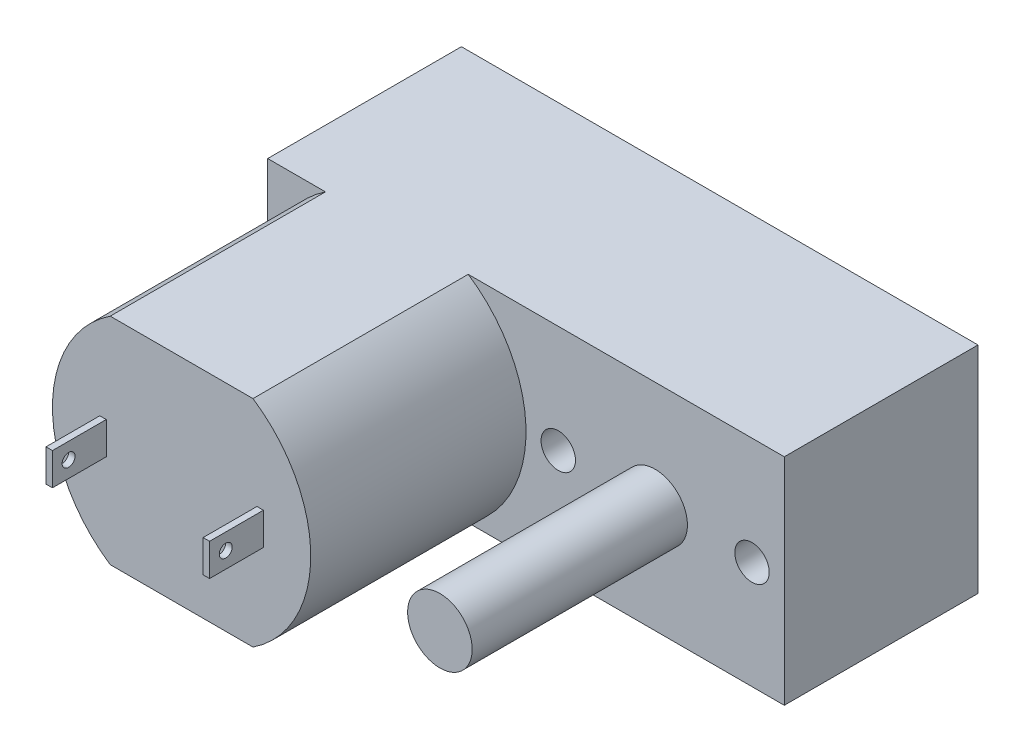
ISO-10303-21;
HEADER;
FILE_DESCRIPTION(('STEP AP214'),'2;1');
FILE_NAME('part.step','',(''),(''),'','','');
FILE_SCHEMA(('AUTOMOTIVE_DESIGN { 1 0 10303 214 1 1 1 1 }'));
ENDSEC;
DATA;
#1=APPLICATION_CONTEXT('core data for automotive mechanical design processes');
#2=APPLICATION_PROTOCOL_DEFINITION('international standard','automotive_design',2000,#1);
#3=PRODUCT_CONTEXT('',#1,'mechanical');
#4=PRODUCT('Part','Part','',(#3));
#5=PRODUCT_RELATED_PRODUCT_CATEGORY('part','',(#4));
#6=PRODUCT_DEFINITION_FORMATION('','',#4);
#7=PRODUCT_DEFINITION_CONTEXT('part definition',#1,'design');
#8=PRODUCT_DEFINITION('design','',#6,#7);
#9=PRODUCT_DEFINITION_SHAPE('','',#8);
#10=(LENGTH_UNIT() NAMED_UNIT(*) SI_UNIT(.MILLI.,.METRE.));
#11=(NAMED_UNIT(*) PLANE_ANGLE_UNIT() SI_UNIT($,.RADIAN.));
#12=(NAMED_UNIT(*) SI_UNIT($,.STERADIAN.) SOLID_ANGLE_UNIT());
#13=UNCERTAINTY_MEASURE_WITH_UNIT(LENGTH_MEASURE(1.E-05),#10,'distance_accuracy_value','');
#14=(GEOMETRIC_REPRESENTATION_CONTEXT(3) GLOBAL_UNCERTAINTY_ASSIGNED_CONTEXT((#13)) GLOBAL_UNIT_ASSIGNED_CONTEXT((#10,
#11,#12)) REPRESENTATION_CONTEXT('',''));
#15=CARTESIAN_POINT('',(0.,0.,0.));
#16=DIRECTION('',(0.,0.,1.));
#17=DIRECTION('',(1.,0.,0.));
#18=AXIS2_PLACEMENT_3D('',#15,#16,#17);
#19=CARTESIAN_POINT('',(0.,0.,19.));
#20=DIRECTION('',(0.,0.,-1.));
#21=DIRECTION('',(-1.,0.,0.));
#22=AXIS2_PLACEMENT_3D('',#19,#20,#21);
#23=PLANE('',#22);
#24=DIRECTION('',(0.,-1.,0.));
#25=VECTOR('',#24,1.);
#26=CARTESIAN_POINT('',(9.5,4.25,19.));
#27=LINE('',#26,#25);
#28=CARTESIAN_POINT('',(9.5,5.75,19.));
#29=VERTEX_POINT('',#28);
#30=CARTESIAN_POINT('',(9.5,4.25,19.));
#31=VERTEX_POINT('',#30);
#32=EDGE_CURVE('E207',#29,#31,#27,.T.);
#33=ORIENTED_EDGE('',*,*,#32,.F.);
#34=DIRECTION('',(-1.,0.,0.));
#35=VECTOR('',#34,1.);
#36=CARTESIAN_POINT('',(9.5,5.75,19.));
#37=LINE('',#36,#35);
#38=CARTESIAN_POINT('',(9.8,5.75,19.));
#39=VERTEX_POINT('',#38);
#40=EDGE_CURVE('E200',#39,#29,#37,.T.);
#41=ORIENTED_EDGE('',*,*,#40,.F.);
#42=DIRECTION('',(0.,1.,0.));
#43=VECTOR('',#42,1.);
#44=CARTESIAN_POINT('',(9.8,4.25,19.));
#45=LINE('',#44,#43);
#46=CARTESIAN_POINT('',(9.8,4.25,19.));
#47=VERTEX_POINT('',#46);
#48=EDGE_CURVE('E205',#47,#39,#45,.T.);
#49=ORIENTED_EDGE('',*,*,#48,.F.);
#50=DIRECTION('',(1.,0.,0.));
#51=VECTOR('',#50,1.);
#52=CARTESIAN_POINT('',(9.5,4.25,19.));
#53=LINE('',#52,#51);
#54=EDGE_CURVE('E206',#31,#47,#53,.T.);
#55=ORIENTED_EDGE('',*,*,#54,.F.);
#56=EDGE_LOOP('',(#33,#41,#49,#55));
#57=FACE_BOUND('',#56,.T.);
#58=DIRECTION('',(-1.,0.,0.));
#59=VECTOR('',#58,1.);
#60=CARTESIAN_POINT('',(0.,10.,19.));
#61=LINE('',#60,#59);
#62=CARTESIAN_POINT('',(9.3166247903554,10.,19.));
#63=VERTEX_POINT('',#62);
#64=CARTESIAN_POINT('',(2.6833752096446,10.,19.));
#65=VERTEX_POINT('',#64);
#66=EDGE_CURVE('E284',#63,#65,#61,.T.);
#67=ORIENTED_EDGE('',*,*,#66,.T.);
#68=CARTESIAN_POINT('',(6.,5.,19.));
#69=DIRECTION('',(0.,0.,1.));
#70=DIRECTION('',(1.,0.,0.));
#71=AXIS2_PLACEMENT_3D('',#68,#69,#70);
#72=CIRCLE('',#71,6.);
#73=CARTESIAN_POINT('',(2.6833752096446,0.,19.));
#74=VERTEX_POINT('',#73);
#75=EDGE_CURVE('E270',#65,#74,#72,.T.);
#76=ORIENTED_EDGE('',*,*,#75,.T.);
#77=DIRECTION('',(1.,0.,0.));
#78=VECTOR('',#77,1.);
#79=CARTESIAN_POINT('',(0.,0.,19.));
#80=LINE('',#79,#78);
#81=CARTESIAN_POINT('',(9.3166247903554,0.,19.));
#82=VERTEX_POINT('',#81);
#83=EDGE_CURVE('E276',#74,#82,#80,.T.);
#84=ORIENTED_EDGE('',*,*,#83,.T.);
#85=EDGE_CURVE('E264',#82,#63,#72,.T.);
#86=ORIENTED_EDGE('',*,*,#85,.T.);
#87=EDGE_LOOP('',(#67,#76,#84,#86));
#88=FACE_BOUND('',#87,.T.);
#89=DIRECTION('',(0.,1.,0.));
#90=VECTOR('',#89,1.);
#91=CARTESIAN_POINT('',(2.5,5.75,19.));
#92=LINE('',#91,#90);
#93=CARTESIAN_POINT('',(2.5,4.25,19.));
#94=VERTEX_POINT('',#93);
#95=CARTESIAN_POINT('',(2.5,5.75,19.));
#96=VERTEX_POINT('',#95);
#97=EDGE_CURVE('E54',#94,#96,#92,.T.);
#98=ORIENTED_EDGE('',*,*,#97,.F.);
#99=DIRECTION('',(1.,0.,0.));
#100=VECTOR('',#99,1.);
#101=CARTESIAN_POINT('',(2.5,4.25,19.));
#102=LINE('',#101,#100);
#103=CARTESIAN_POINT('',(2.2,4.25,19.));
#104=VERTEX_POINT('',#103);
#105=EDGE_CURVE('E56',#104,#94,#102,.T.);
#106=ORIENTED_EDGE('',*,*,#105,.F.);
#107=DIRECTION('',(0.,-1.,0.));
#108=VECTOR('',#107,1.);
#109=CARTESIAN_POINT('',(2.2,5.75,19.));
#110=LINE('',#109,#108);
#111=CARTESIAN_POINT('',(2.2,5.75,19.));
#112=VERTEX_POINT('',#111);
#113=EDGE_CURVE('E602',#112,#104,#110,.T.);
#114=ORIENTED_EDGE('',*,*,#113,.F.);
#115=DIRECTION('',(-1.,0.,0.));
#116=VECTOR('',#115,1.);
#117=CARTESIAN_POINT('',(2.5,5.75,19.));
#118=LINE('',#117,#116);
#119=EDGE_CURVE('E601',#96,#112,#118,.T.);
#120=ORIENTED_EDGE('',*,*,#119,.F.);
#121=EDGE_LOOP('',(#98,#106,#114,#120));
#122=FACE_BOUND('',#121,.T.);
#123=ADVANCED_FACE('F37',(#57,#88,#122),#23,.F.);
#124=CARTESIAN_POINT('',(6.,5.,19.));
#125=DIRECTION('',(0.,0.,-1.));
#126=DIRECTION('',(-1.,0.,0.));
#127=AXIS2_PLACEMENT_3D('',#124,#125,#126);
#128=CYLINDRICAL_SURFACE('',#127,6.);
#129=CARTESIAN_POINT('',(6.,5.,9.));
#130=DIRECTION('',(0.,0.,-1.));
#131=DIRECTION('',(-1.,0.,0.));
#132=AXIS2_PLACEMENT_3D('',#129,#130,#131);
#133=CIRCLE('',#132,6.);
#134=CARTESIAN_POINT('',(9.3166247903554,10.,9.));
#135=VERTEX_POINT('',#134);
#136=CARTESIAN_POINT('',(9.3166247903554,0.,9.));
#137=VERTEX_POINT('',#136);
#138=EDGE_CURVE('E265',#135,#137,#133,.T.);
#139=ORIENTED_EDGE('',*,*,#138,.F.);
#140=DIRECTION('',(0.,0.,-1.));
#141=VECTOR('',#140,1.);
#142=CARTESIAN_POINT('',(9.3166247903554,10.,19.));
#143=LINE('',#142,#141);
#144=EDGE_CURVE('E268',#63,#135,#143,.T.);
#145=ORIENTED_EDGE('',*,*,#144,.F.);
#146=ORIENTED_EDGE('',*,*,#85,.F.);
#147=DIRECTION('',(0.,0.,-1.));
#148=VECTOR('',#147,1.);
#149=CARTESIAN_POINT('',(9.3166247903554,0.,19.));
#150=LINE('',#149,#148);
#151=EDGE_CURVE('E277',#137,#82,#150,.F.);
#152=ORIENTED_EDGE('',*,*,#151,.F.);
#153=EDGE_LOOP('',(#139,#145,#146,#152));
#154=FACE_BOUND('',#153,.T.);
#155=ADVANCED_FACE('F327',(#154),#128,.T.);
#156=CARTESIAN_POINT('',(6.,5.,9.));
#157=DIRECTION('',(0.,0.,-1.));
#158=DIRECTION('',(-1.,0.,0.));
#159=AXIS2_PLACEMENT_3D('',#156,#157,#158);
#160=CIRCLE('',#159,6.);
#161=CARTESIAN_POINT('',(0.,5.,9.));
#162=VERTEX_POINT('',#161);
#163=CARTESIAN_POINT('',(2.6833752096446,10.,9.));
#164=VERTEX_POINT('',#163);
#165=EDGE_CURVE('E48',#162,#164,#160,.T.);
#166=ORIENTED_EDGE('',*,*,#165,.F.);
#167=CARTESIAN_POINT('',(2.6833752096446,0.,9.));
#168=VERTEX_POINT('',#167);
#169=EDGE_CURVE('E288',#168,#162,#160,.T.);
#170=ORIENTED_EDGE('',*,*,#169,.F.);
#171=DIRECTION('',(0.,0.,-1.));
#172=VECTOR('',#171,1.);
#173=CARTESIAN_POINT('',(2.6833752096446,0.,19.));
#174=LINE('',#173,#172);
#175=EDGE_CURVE('E272',#74,#168,#174,.T.);
#176=ORIENTED_EDGE('',*,*,#175,.F.);
#177=ORIENTED_EDGE('',*,*,#75,.F.);
#178=DIRECTION('',(0.,0.,-1.));
#179=VECTOR('',#178,1.);
#180=CARTESIAN_POINT('',(2.6833752096446,10.,19.));
#181=LINE('',#180,#179);
#182=EDGE_CURVE('E271',#164,#65,#181,.F.);
#183=ORIENTED_EDGE('',*,*,#182,.F.);
#184=EDGE_LOOP('',(#166,#170,#176,#177,#183));
#185=FACE_BOUND('',#184,.T.);
#186=ADVANCED_FACE('F313',(#185),#128,.T.);
#187=CARTESIAN_POINT('',(0.,0.,0.));
#188=DIRECTION('',(0.,0.,-1.));
#189=DIRECTION('',(-1.,0.,0.));
#190=AXIS2_PLACEMENT_3D('',#187,#188,#189);
#191=PLANE('',#190);
#192=DIRECTION('',(0.,-1.,0.));
#193=VECTOR('',#192,1.);
#194=CARTESIAN_POINT('',(0.,0.,0.));
#195=LINE('',#194,#193);
#196=CARTESIAN_POINT('',(0.,10.,0.));
#197=VERTEX_POINT('',#196);
#198=CARTESIAN_POINT('',(0.,0.,0.));
#199=VERTEX_POINT('',#198);
#200=EDGE_CURVE('E226',#197,#199,#195,.T.);
#201=ORIENTED_EDGE('',*,*,#200,.F.);
#202=DIRECTION('',(-1.,0.,0.));
#203=VECTOR('',#202,1.);
#204=CARTESIAN_POINT('',(0.,10.,0.));
#205=LINE('',#204,#203);
#206=CARTESIAN_POINT('',(24.,10.,0.));
#207=VERTEX_POINT('',#206);
#208=EDGE_CURVE('E282',#207,#197,#205,.T.);
#209=ORIENTED_EDGE('',*,*,#208,.F.);
#210=DIRECTION('',(0.,1.,0.));
#211=VECTOR('',#210,1.);
#212=CARTESIAN_POINT('',(24.,0.,0.));
#213=LINE('',#212,#211);
#214=CARTESIAN_POINT('',(24.,0.,0.));
#215=VERTEX_POINT('',#214);
#216=EDGE_CURVE('E246',#215,#207,#213,.T.);
#217=ORIENTED_EDGE('',*,*,#216,.F.);
#218=DIRECTION('',(1.,0.,0.));
#219=VECTOR('',#218,1.);
#220=CARTESIAN_POINT('',(0.,0.,0.));
#221=LINE('',#220,#219);
#222=EDGE_CURVE('E279',#199,#215,#221,.T.);
#223=ORIENTED_EDGE('',*,*,#222,.F.);
#224=EDGE_LOOP('',(#201,#209,#217,#223));
#225=FACE_BOUND('',#224,.T.);
#226=ADVANCED_FACE('F330',(#225),#191,.T.);
#227=CARTESIAN_POINT('',(0.,0.,19.));
#228=DIRECTION('',(0.,1.,0.));
#229=DIRECTION('',(0.,0.,1.));
#230=AXIS2_PLACEMENT_3D('',#227,#228,#229);
#231=PLANE('',#230);
#232=ORIENTED_EDGE('',*,*,#175,.T.);
#233=DIRECTION('',(1.,0.,0.));
#234=VECTOR('',#233,1.);
#235=CARTESIAN_POINT('',(0.,0.,9.));
#236=LINE('',#235,#234);
#237=CARTESIAN_POINT('',(0.,0.,9.));
#238=VERTEX_POINT('',#237);
#239=EDGE_CURVE('E237',#238,#168,#236,.T.);
#240=ORIENTED_EDGE('',*,*,#239,.F.);
#241=DIRECTION('',(0.,0.,-1.));
#242=VECTOR('',#241,1.);
#243=CARTESIAN_POINT('',(0.,0.,9.));
#244=LINE('',#243,#242);
#245=EDGE_CURVE('E259',#238,#199,#244,.T.);
#246=ORIENTED_EDGE('',*,*,#245,.T.);
#247=ORIENTED_EDGE('',*,*,#222,.T.);
#248=DIRECTION('',(0.,0.,-1.));
#249=VECTOR('',#248,1.);
#250=CARTESIAN_POINT('',(24.,0.,9.));
#251=LINE('',#250,#249);
#252=CARTESIAN_POINT('',(24.,0.,9.));
#253=VERTEX_POINT('',#252);
#254=EDGE_CURVE('E258',#253,#215,#251,.T.);
#255=ORIENTED_EDGE('',*,*,#254,.F.);
#256=EDGE_CURVE('E234',#137,#253,#236,.T.);
#257=ORIENTED_EDGE('',*,*,#256,.F.);
#258=ORIENTED_EDGE('',*,*,#151,.T.);
#259=ORIENTED_EDGE('',*,*,#83,.F.);
#260=EDGE_LOOP('',(#232,#240,#246,#247,#255,#257,#258,#259));
#261=FACE_BOUND('',#260,.T.);
#262=ADVANCED_FACE('F45',(#261),#231,.F.);
#263=CARTESIAN_POINT('',(0.,10.,19.));
#264=DIRECTION('',(0.,-1.,0.));
#265=DIRECTION('',(0.,0.,-1.));
#266=AXIS2_PLACEMENT_3D('',#263,#264,#265);
#267=PLANE('',#266);
#268=ORIENTED_EDGE('',*,*,#144,.T.);
#269=DIRECTION('',(-1.,0.,0.));
#270=VECTOR('',#269,1.);
#271=CARTESIAN_POINT('',(0.,10.,9.));
#272=LINE('',#271,#270);
#273=CARTESIAN_POINT('',(24.,10.,9.));
#274=VERTEX_POINT('',#273);
#275=EDGE_CURVE('E244',#274,#135,#272,.T.);
#276=ORIENTED_EDGE('',*,*,#275,.F.);
#277=DIRECTION('',(0.,0.,-1.));
#278=VECTOR('',#277,1.);
#279=CARTESIAN_POINT('',(24.,10.,9.));
#280=LINE('',#279,#278);
#281=EDGE_CURVE('E251',#274,#207,#280,.T.);
#282=ORIENTED_EDGE('',*,*,#281,.T.);
#283=ORIENTED_EDGE('',*,*,#208,.T.);
#284=DIRECTION('',(0.,0.,-1.));
#285=VECTOR('',#284,1.);
#286=CARTESIAN_POINT('',(0.,10.,9.));
#287=LINE('',#286,#285);
#288=CARTESIAN_POINT('',(0.,10.,9.));
#289=VERTEX_POINT('',#288);
#290=EDGE_CURVE('E241',#289,#197,#287,.T.);
#291=ORIENTED_EDGE('',*,*,#290,.F.);
#292=EDGE_CURVE('E243',#164,#289,#272,.T.);
#293=ORIENTED_EDGE('',*,*,#292,.F.);
#294=ORIENTED_EDGE('',*,*,#182,.T.);
#295=ORIENTED_EDGE('',*,*,#66,.F.);
#296=EDGE_LOOP('',(#268,#276,#282,#283,#291,#293,#294,#295));
#297=FACE_BOUND('',#296,.T.);
#298=ADVANCED_FACE('F300',(#297),#267,.F.);
#299=CARTESIAN_POINT('',(0.,0.,9.));
#300=DIRECTION('',(1.,0.,0.));
#301=DIRECTION('',(0.,0.,-1.));
#302=AXIS2_PLACEMENT_3D('',#299,#300,#301);
#303=PLANE('',#302);
#304=DIRECTION('',(0.,-1.,0.));
#305=VECTOR('',#304,1.);
#306=CARTESIAN_POINT('',(0.,0.,9.));
#307=LINE('',#306,#305);
#308=EDGE_CURVE('E232',#162,#238,#307,.T.);
#309=ORIENTED_EDGE('',*,*,#308,.F.);
#310=EDGE_CURVE('E233',#289,#162,#307,.T.);
#311=ORIENTED_EDGE('',*,*,#310,.F.);
#312=ORIENTED_EDGE('',*,*,#290,.T.);
#313=ORIENTED_EDGE('',*,*,#200,.T.);
#314=ORIENTED_EDGE('',*,*,#245,.F.);
#315=EDGE_LOOP('',(#309,#311,#312,#313,#314));
#316=FACE_BOUND('',#315,.T.);
#317=ADVANCED_FACE('F304',(#316),#303,.F.);
#318=CARTESIAN_POINT('',(0.,0.,9.));
#319=DIRECTION('',(0.,0.,-1.));
#320=DIRECTION('',(-1.,0.,0.));
#321=AXIS2_PLACEMENT_3D('',#318,#319,#320);
#322=PLANE('',#321);
#323=ORIENTED_EDGE('',*,*,#239,.T.);
#324=ORIENTED_EDGE('',*,*,#169,.T.);
#325=ORIENTED_EDGE('',*,*,#308,.T.);
#326=EDGE_LOOP('',(#323,#324,#325));
#327=FACE_BOUND('',#326,.T.);
#328=ADVANCED_FACE('F307',(#327),#322,.F.);
#329=ORIENTED_EDGE('',*,*,#310,.T.);
#330=ORIENTED_EDGE('',*,*,#165,.T.);
#331=ORIENTED_EDGE('',*,*,#292,.T.);
#332=EDGE_LOOP('',(#329,#330,#331));
#333=FACE_BOUND('',#332,.T.);
#334=ADVANCED_FACE('F294',(#333),#322,.F.);
#335=CARTESIAN_POINT('',(13.5,5.,9.));
#336=DIRECTION('',(0.,0.,1.));
#337=DIRECTION('',(1.,0.,0.));
#338=AXIS2_PLACEMENT_3D('',#335,#336,#337);
#339=CIRCLE('',#338,0.800000000000001);
#340=CARTESIAN_POINT('',(14.3,5.,9.));
#341=VERTEX_POINT('',#340);
#342=EDGE_CURVE('E224',#341,#341,#339,.T.);
#343=ORIENTED_EDGE('',*,*,#342,.F.);
#344=EDGE_LOOP('',(#343));
#345=FACE_BOUND('',#344,.T.);
#346=CARTESIAN_POINT('',(22.5,5.,9.));
#347=DIRECTION('',(0.,0.,1.));
#348=DIRECTION('',(1.,0.,0.));
#349=AXIS2_PLACEMENT_3D('',#346,#347,#348);
#350=CIRCLE('',#349,0.799999999999999);
#351=CARTESIAN_POINT('',(23.3,5.,9.));
#352=VERTEX_POINT('',#351);
#353=EDGE_CURVE('E179',#352,#352,#350,.T.);
#354=ORIENTED_EDGE('',*,*,#353,.F.);
#355=EDGE_LOOP('',(#354));
#356=FACE_BOUND('',#355,.T.);
#357=CARTESIAN_POINT('',(18.,5.,9.));
#358=DIRECTION('',(0.,0.,-1.));
#359=DIRECTION('',(-1.,0.,0.));
#360=AXIS2_PLACEMENT_3D('',#357,#358,#359);
#361=CIRCLE('',#360,1.5);
#362=CARTESIAN_POINT('',(16.5,5.,9.));
#363=VERTEX_POINT('',#362);
#364=EDGE_CURVE('E12',#363,#363,#361,.F.);
#365=ORIENTED_EDGE('',*,*,#364,.F.);
#366=EDGE_LOOP('',(#365));
#367=FACE_BOUND('',#366,.T.);
#368=ORIENTED_EDGE('',*,*,#275,.T.);
#369=ORIENTED_EDGE('',*,*,#138,.T.);
#370=ORIENTED_EDGE('',*,*,#256,.T.);
#371=DIRECTION('',(0.,1.,0.));
#372=VECTOR('',#371,1.);
#373=CARTESIAN_POINT('',(24.,0.,9.));
#374=LINE('',#373,#372);
#375=EDGE_CURVE('E239',#253,#274,#374,.T.);
#376=ORIENTED_EDGE('',*,*,#375,.T.);
#377=EDGE_LOOP('',(#368,#369,#370,#376));
#378=FACE_BOUND('',#377,.T.);
#379=ADVANCED_FACE('F318',(#345,#356,#367,#378),#322,.F.);
#380=CARTESIAN_POINT('',(24.,0.,9.));
#381=DIRECTION('',(-1.,0.,0.));
#382=DIRECTION('',(0.,0.,1.));
#383=AXIS2_PLACEMENT_3D('',#380,#381,#382);
#384=PLANE('',#383);
#385=ORIENTED_EDGE('',*,*,#216,.T.);
#386=ORIENTED_EDGE('',*,*,#281,.F.);
#387=ORIENTED_EDGE('',*,*,#375,.F.);
#388=ORIENTED_EDGE('',*,*,#254,.T.);
#389=EDGE_LOOP('',(#385,#386,#387,#388));
#390=FACE_BOUND('',#389,.T.);
#391=ADVANCED_FACE('F322',(#390),#384,.F.);
#392=CARTESIAN_POINT('',(18.,5.,19.));
#393=DIRECTION('',(0.,0.,-1.));
#394=DIRECTION('',(-1.,0.,0.));
#395=AXIS2_PLACEMENT_3D('',#392,#393,#394);
#396=CYLINDRICAL_SURFACE('',#395,1.5);
#397=CARTESIAN_POINT('',(18.,5.,19.));
#398=DIRECTION('',(0.,0.,1.));
#399=DIRECTION('',(1.,0.,0.));
#400=AXIS2_PLACEMENT_3D('',#397,#398,#399);
#401=CIRCLE('',#400,1.5);
#402=CARTESIAN_POINT('',(19.5,5.,19.));
#403=VERTEX_POINT('',#402);
#404=EDGE_CURVE('E225',#403,#403,#401,.T.);
#405=ORIENTED_EDGE('',*,*,#404,.F.);
#406=EDGE_LOOP('',(#405));
#407=FACE_BOUND('',#406,.T.);
#408=ORIENTED_EDGE('',*,*,#364,.T.);
#409=EDGE_LOOP('',(#408));
#410=FACE_BOUND('',#409,.T.);
#411=ADVANCED_FACE('F399',(#407,#410),#396,.T.);
#412=CARTESIAN_POINT('',(18.,5.,19.));
#413=DIRECTION('',(0.,0.,1.));
#414=DIRECTION('',(1.,0.,0.));
#415=AXIS2_PLACEMENT_3D('',#412,#413,#414);
#416=PLANE('',#415);
#417=ORIENTED_EDGE('',*,*,#404,.T.);
#418=EDGE_LOOP('',(#417));
#419=FACE_BOUND('',#418,.T.);
#420=ADVANCED_FACE('F408',(#419),#416,.T.);
#421=CARTESIAN_POINT('',(22.5,5.,6.));
#422=DIRECTION('',(0.,0.,1.));
#423=DIRECTION('',(1.,0.,0.));
#424=AXIS2_PLACEMENT_3D('',#421,#422,#423);
#425=CYLINDRICAL_SURFACE('',#424,0.799999999999999);
#426=CARTESIAN_POINT('',(22.5,5.,6.));
#427=DIRECTION('',(0.,0.,1.));
#428=DIRECTION('',(1.,0.,0.));
#429=AXIS2_PLACEMENT_3D('',#426,#427,#428);
#430=CIRCLE('',#429,0.799999999999999);
#431=CARTESIAN_POINT('',(23.3,5.,6.));
#432=VERTEX_POINT('',#431);
#433=EDGE_CURVE('E178',#432,#432,#430,.T.);
#434=ORIENTED_EDGE('',*,*,#433,.F.);
#435=EDGE_LOOP('',(#434));
#436=FACE_BOUND('',#435,.T.);
#437=ORIENTED_EDGE('',*,*,#353,.T.);
#438=EDGE_LOOP('',(#437));
#439=FACE_BOUND('',#438,.T.);
#440=ADVANCED_FACE('F412',(#436,#439),#425,.F.);
#441=CARTESIAN_POINT('',(22.5,5.,6.));
#442=DIRECTION('',(0.,0.,1.));
#443=DIRECTION('',(1.,0.,0.));
#444=AXIS2_PLACEMENT_3D('',#441,#442,#443);
#445=PLANE('',#444);
#446=ORIENTED_EDGE('',*,*,#433,.T.);
#447=EDGE_LOOP('',(#446));
#448=FACE_BOUND('',#447,.T.);
#449=ADVANCED_FACE('F424',(#448),#445,.T.);
#450=CARTESIAN_POINT('',(13.5,5.,6.));
#451=DIRECTION('',(0.,0.,1.));
#452=DIRECTION('',(1.,0.,0.));
#453=AXIS2_PLACEMENT_3D('',#450,#451,#452);
#454=CYLINDRICAL_SURFACE('',#453,0.800000000000001);
#455=CARTESIAN_POINT('',(13.5,5.,6.));
#456=DIRECTION('',(0.,0.,1.));
#457=DIRECTION('',(1.,0.,0.));
#458=AXIS2_PLACEMENT_3D('',#455,#456,#457);
#459=CIRCLE('',#458,0.800000000000001);
#460=CARTESIAN_POINT('',(14.3,5.,6.));
#461=VERTEX_POINT('',#460);
#462=EDGE_CURVE('E218',#461,#461,#459,.T.);
#463=ORIENTED_EDGE('',*,*,#462,.F.);
#464=EDGE_LOOP('',(#463));
#465=FACE_BOUND('',#464,.T.);
#466=ORIENTED_EDGE('',*,*,#342,.T.);
#467=EDGE_LOOP('',(#466));
#468=FACE_BOUND('',#467,.T.);
#469=ADVANCED_FACE('F433',(#465,#468),#454,.F.);
#470=CARTESIAN_POINT('',(13.5,5.,6.));
#471=DIRECTION('',(0.,0.,1.));
#472=DIRECTION('',(1.,0.,0.));
#473=AXIS2_PLACEMENT_3D('',#470,#471,#472);
#474=PLANE('',#473);
#475=ORIENTED_EDGE('',*,*,#462,.T.);
#476=EDGE_LOOP('',(#475));
#477=FACE_BOUND('',#476,.T.);
#478=ADVANCED_FACE('F445',(#477),#474,.T.);
#479=CARTESIAN_POINT('',(9.5,4.25,21.5));
#480=DIRECTION('',(1.,0.,0.));
#481=DIRECTION('',(0.,0.,-1.));
#482=AXIS2_PLACEMENT_3D('',#479,#480,#481);
#483=PLANE('',#482);
#484=CARTESIAN_POINT('',(9.5,5.00000000000001,20.75));
#485=DIRECTION('',(1.,0.,0.));
#486=DIRECTION('',(0.,0.,-1.));
#487=AXIS2_PLACEMENT_3D('',#484,#485,#486);
#488=CIRCLE('',#487,0.299999999999997);
#489=CARTESIAN_POINT('',(9.5,5.00000000000001,20.45));
#490=VERTEX_POINT('',#489);
#491=EDGE_CURVE('E190',#490,#490,#488,.T.);
#492=ORIENTED_EDGE('',*,*,#491,.T.);
#493=EDGE_LOOP('',(#492));
#494=FACE_BOUND('',#493,.T.);
#495=ORIENTED_EDGE('',*,*,#32,.T.);
#496=DIRECTION('',(0.,0.,-1.));
#497=VECTOR('',#496,1.);
#498=CARTESIAN_POINT('',(9.5,4.25,21.5));
#499=LINE('',#498,#497);
#500=CARTESIAN_POINT('',(9.5,4.25,21.5));
#501=VERTEX_POINT('',#500);
#502=EDGE_CURVE('E183',#501,#31,#499,.T.);
#503=ORIENTED_EDGE('',*,*,#502,.F.);
#504=DIRECTION('',(0.,-1.,0.));
#505=VECTOR('',#504,1.);
#506=CARTESIAN_POINT('',(9.5,4.25,21.5));
#507=LINE('',#506,#505);
#508=CARTESIAN_POINT('',(9.5,5.75,21.5));
#509=VERTEX_POINT('',#508);
#510=EDGE_CURVE('E201',#509,#501,#507,.T.);
#511=ORIENTED_EDGE('',*,*,#510,.F.);
#512=DIRECTION('',(0.,0.,-1.));
#513=VECTOR('',#512,1.);
#514=CARTESIAN_POINT('',(9.5,5.75,21.5));
#515=LINE('',#514,#513);
#516=EDGE_CURVE('E192',#509,#29,#515,.T.);
#517=ORIENTED_EDGE('',*,*,#516,.T.);
#518=EDGE_LOOP('',(#495,#503,#511,#517));
#519=FACE_BOUND('',#518,.T.);
#520=ADVANCED_FACE('F453',(#494,#519),#483,.F.);
#521=CARTESIAN_POINT('',(9.5,4.25,21.5));
#522=DIRECTION('',(0.,1.,0.));
#523=DIRECTION('',(0.,0.,1.));
#524=AXIS2_PLACEMENT_3D('',#521,#522,#523);
#525=PLANE('',#524);
#526=ORIENTED_EDGE('',*,*,#54,.T.);
#527=DIRECTION('',(0.,0.,-1.));
#528=VECTOR('',#527,1.);
#529=CARTESIAN_POINT('',(9.8,4.25,21.5));
#530=LINE('',#529,#528);
#531=CARTESIAN_POINT('',(9.8,4.25,21.5));
#532=VERTEX_POINT('',#531);
#533=EDGE_CURVE('E187',#532,#47,#530,.T.);
#534=ORIENTED_EDGE('',*,*,#533,.F.);
#535=DIRECTION('',(1.,0.,0.));
#536=VECTOR('',#535,1.);
#537=CARTESIAN_POINT('',(9.5,4.25,21.5));
#538=LINE('',#537,#536);
#539=EDGE_CURVE('E214',#501,#532,#538,.T.);
#540=ORIENTED_EDGE('',*,*,#539,.F.);
#541=ORIENTED_EDGE('',*,*,#502,.T.);
#542=EDGE_LOOP('',(#526,#534,#540,#541));
#543=FACE_BOUND('',#542,.T.);
#544=ADVANCED_FACE('F461',(#543),#525,.F.);
#545=CARTESIAN_POINT('',(9.8,4.25,21.5));
#546=DIRECTION('',(-1.,0.,0.));
#547=DIRECTION('',(0.,0.,1.));
#548=AXIS2_PLACEMENT_3D('',#545,#546,#547);
#549=PLANE('',#548);
#550=CARTESIAN_POINT('',(9.8,5.00000000000001,20.75));
#551=DIRECTION('',(-1.,0.,0.));
#552=DIRECTION('',(0.,-1.,0.));
#553=AXIS2_PLACEMENT_3D('',#550,#551,#552);
#554=CIRCLE('',#553,0.299999999999997);
#555=CARTESIAN_POINT('',(9.8,4.70000000000001,20.75));
#556=VERTEX_POINT('',#555);
#557=EDGE_CURVE('E586',#556,#556,#554,.T.);
#558=ORIENTED_EDGE('',*,*,#557,.T.);
#559=EDGE_LOOP('',(#558));
#560=FACE_BOUND('',#559,.T.);
#561=ORIENTED_EDGE('',*,*,#48,.T.);
#562=DIRECTION('',(0.,0.,-1.));
#563=VECTOR('',#562,1.);
#564=CARTESIAN_POINT('',(9.8,5.75,21.5));
#565=LINE('',#564,#563);
#566=CARTESIAN_POINT('',(9.8,5.75,21.5));
#567=VERTEX_POINT('',#566);
#568=EDGE_CURVE('E195',#567,#39,#565,.T.);
#569=ORIENTED_EDGE('',*,*,#568,.F.);
#570=DIRECTION('',(0.,1.,0.));
#571=VECTOR('',#570,1.);
#572=CARTESIAN_POINT('',(9.8,4.25,21.5));
#573=LINE('',#572,#571);
#574=EDGE_CURVE('E213',#532,#567,#573,.T.);
#575=ORIENTED_EDGE('',*,*,#574,.F.);
#576=ORIENTED_EDGE('',*,*,#533,.T.);
#577=EDGE_LOOP('',(#561,#569,#575,#576));
#578=FACE_BOUND('',#577,.T.);
#579=ADVANCED_FACE('F475',(#560,#578),#549,.F.);
#580=CARTESIAN_POINT('',(9.5,5.75,21.5));
#581=DIRECTION('',(0.,-1.,0.));
#582=DIRECTION('',(0.,0.,-1.));
#583=AXIS2_PLACEMENT_3D('',#580,#581,#582);
#584=PLANE('',#583);
#585=ORIENTED_EDGE('',*,*,#40,.T.);
#586=ORIENTED_EDGE('',*,*,#516,.F.);
#587=DIRECTION('',(-1.,0.,0.));
#588=VECTOR('',#587,1.);
#589=CARTESIAN_POINT('',(9.5,5.75,21.5));
#590=LINE('',#589,#588);
#591=EDGE_CURVE('E196',#567,#509,#590,.T.);
#592=ORIENTED_EDGE('',*,*,#591,.F.);
#593=ORIENTED_EDGE('',*,*,#568,.T.);
#594=EDGE_LOOP('',(#585,#586,#592,#593));
#595=FACE_BOUND('',#594,.T.);
#596=ADVANCED_FACE('F483',(#595),#584,.F.);
#597=CARTESIAN_POINT('',(0.,0.,21.5));
#598=DIRECTION('',(0.,0.,-1.));
#599=DIRECTION('',(-1.,0.,0.));
#600=AXIS2_PLACEMENT_3D('',#597,#598,#599);
#601=PLANE('',#600);
#602=ORIENTED_EDGE('',*,*,#510,.T.);
#603=ORIENTED_EDGE('',*,*,#539,.T.);
#604=ORIENTED_EDGE('',*,*,#574,.T.);
#605=ORIENTED_EDGE('',*,*,#591,.T.);
#606=EDGE_LOOP('',(#602,#603,#604,#605));
#607=FACE_BOUND('',#606,.T.);
#608=ADVANCED_FACE('F495',(#607),#601,.F.);
#609=CARTESIAN_POINT('',(2.5,5.75,21.5));
#610=DIRECTION('',(-1.,0.,0.));
#611=DIRECTION('',(0.,-1.,0.));
#612=AXIS2_PLACEMENT_3D('',#609,#610,#611);
#613=PLANE('',#612);
#614=CARTESIAN_POINT('',(2.5,5.,20.75));
#615=DIRECTION('',(-1.,0.,0.));
#616=DIRECTION('',(0.,-1.,0.));
#617=AXIS2_PLACEMENT_3D('',#614,#615,#616);
#618=CIRCLE('',#617,0.299999999999997);
#619=CARTESIAN_POINT('',(2.5,4.7,20.75));
#620=VERTEX_POINT('',#619);
#621=EDGE_CURVE('E591',#620,#620,#618,.T.);
#622=ORIENTED_EDGE('',*,*,#621,.T.);
#623=EDGE_LOOP('',(#622));
#624=FACE_BOUND('',#623,.T.);
#625=ORIENTED_EDGE('',*,*,#97,.T.);
#626=DIRECTION('',(0.,0.,-1.));
#627=VECTOR('',#626,1.);
#628=CARTESIAN_POINT('',(2.5,5.75,21.5));
#629=LINE('',#628,#627);
#630=CARTESIAN_POINT('',(2.5,5.75,21.5));
#631=VERTEX_POINT('',#630);
#632=EDGE_CURVE('E157',#631,#96,#629,.T.);
#633=ORIENTED_EDGE('',*,*,#632,.F.);
#634=DIRECTION('',(0.,1.,0.));
#635=VECTOR('',#634,1.);
#636=CARTESIAN_POINT('',(2.5,5.75,21.5));
#637=LINE('',#636,#635);
#638=CARTESIAN_POINT('',(2.5,4.25,21.5));
#639=VERTEX_POINT('',#638);
#640=EDGE_CURVE('E164',#639,#631,#637,.T.);
#641=ORIENTED_EDGE('',*,*,#640,.F.);
#642=DIRECTION('',(0.,0.,-1.));
#643=VECTOR('',#642,1.);
#644=CARTESIAN_POINT('',(2.5,4.25,21.5));
#645=LINE('',#644,#643);
#646=EDGE_CURVE('E597',#639,#94,#645,.T.);
#647=ORIENTED_EDGE('',*,*,#646,.T.);
#648=EDGE_LOOP('',(#625,#633,#641,#647));
#649=FACE_BOUND('',#648,.T.);
#650=ADVANCED_FACE('F171',(#624,#649),#613,.F.);
#651=CARTESIAN_POINT('',(2.5,5.75,21.5));
#652=DIRECTION('',(0.,-1.,0.));
#653=DIRECTION('',(0.,0.,-1.));
#654=AXIS2_PLACEMENT_3D('',#651,#652,#653);
#655=PLANE('',#654);
#656=ORIENTED_EDGE('',*,*,#119,.T.);
#657=DIRECTION('',(0.,0.,-1.));
#658=VECTOR('',#657,1.);
#659=CARTESIAN_POINT('',(2.2,5.75,21.5));
#660=LINE('',#659,#658);
#661=CARTESIAN_POINT('',(2.2,5.75,21.5));
#662=VERTEX_POINT('',#661);
#663=EDGE_CURVE('E161',#662,#112,#660,.T.);
#664=ORIENTED_EDGE('',*,*,#663,.F.);
#665=DIRECTION('',(-1.,0.,0.));
#666=VECTOR('',#665,1.);
#667=CARTESIAN_POINT('',(2.5,5.75,21.5));
#668=LINE('',#667,#666);
#669=EDGE_CURVE('E152',#631,#662,#668,.T.);
#670=ORIENTED_EDGE('',*,*,#669,.F.);
#671=ORIENTED_EDGE('',*,*,#632,.T.);
#672=EDGE_LOOP('',(#656,#664,#670,#671));
#673=FACE_BOUND('',#672,.T.);
#674=ADVANCED_FACE('F160',(#673),#655,.F.);
#675=CARTESIAN_POINT('',(2.2,5.75,21.5));
#676=DIRECTION('',(1.,0.,0.));
#677=DIRECTION('',(0.,1.,0.));
#678=AXIS2_PLACEMENT_3D('',#675,#676,#677);
#679=PLANE('',#678);
#680=CARTESIAN_POINT('',(2.2,5.,20.75));
#681=DIRECTION('',(-1.,0.,0.));
#682=DIRECTION('',(0.,-1.,0.));
#683=AXIS2_PLACEMENT_3D('',#680,#681,#682);
#684=CIRCLE('',#683,0.299999999999997);
#685=CARTESIAN_POINT('',(2.2,4.7,20.75));
#686=VERTEX_POINT('',#685);
#687=EDGE_CURVE('E606',#686,#686,#684,.T.);
#688=ORIENTED_EDGE('',*,*,#687,.F.);
#689=EDGE_LOOP('',(#688));
#690=FACE_BOUND('',#689,.T.);
#691=ORIENTED_EDGE('',*,*,#113,.T.);
#692=DIRECTION('',(0.,0.,-1.));
#693=VECTOR('',#692,1.);
#694=CARTESIAN_POINT('',(2.2,4.25,21.5));
#695=LINE('',#694,#693);
#696=CARTESIAN_POINT('',(2.2,4.25,21.5));
#697=VERTEX_POINT('',#696);
#698=EDGE_CURVE('E182',#697,#104,#695,.T.);
#699=ORIENTED_EDGE('',*,*,#698,.F.);
#700=DIRECTION('',(0.,-1.,0.));
#701=VECTOR('',#700,1.);
#702=CARTESIAN_POINT('',(2.2,5.75,21.5));
#703=LINE('',#702,#701);
#704=EDGE_CURVE('E163',#662,#697,#703,.T.);
#705=ORIENTED_EDGE('',*,*,#704,.F.);
#706=ORIENTED_EDGE('',*,*,#663,.T.);
#707=EDGE_LOOP('',(#691,#699,#705,#706));
#708=FACE_BOUND('',#707,.T.);
#709=ADVANCED_FACE('F519',(#690,#708),#679,.F.);
#710=CARTESIAN_POINT('',(2.5,4.25,21.5));
#711=DIRECTION('',(0.,1.,0.));
#712=DIRECTION('',(0.,0.,1.));
#713=AXIS2_PLACEMENT_3D('',#710,#711,#712);
#714=PLANE('',#713);
#715=ORIENTED_EDGE('',*,*,#105,.T.);
#716=ORIENTED_EDGE('',*,*,#646,.F.);
#717=DIRECTION('',(1.,0.,0.));
#718=VECTOR('',#717,1.);
#719=CARTESIAN_POINT('',(2.5,4.25,21.5));
#720=LINE('',#719,#718);
#721=EDGE_CURVE('E168',#697,#639,#720,.T.);
#722=ORIENTED_EDGE('',*,*,#721,.F.);
#723=ORIENTED_EDGE('',*,*,#698,.T.);
#724=EDGE_LOOP('',(#715,#716,#722,#723));
#725=FACE_BOUND('',#724,.T.);
#726=ADVANCED_FACE('F522',(#725),#714,.F.);
#727=CARTESIAN_POINT('',(0.,0.,21.5));
#728=DIRECTION('',(0.,0.,-1.));
#729=DIRECTION('',(-1.,0.,0.));
#730=AXIS2_PLACEMENT_3D('',#727,#728,#729);
#731=PLANE('',#730);
#732=ORIENTED_EDGE('',*,*,#640,.T.);
#733=ORIENTED_EDGE('',*,*,#669,.T.);
#734=ORIENTED_EDGE('',*,*,#704,.T.);
#735=ORIENTED_EDGE('',*,*,#721,.T.);
#736=EDGE_LOOP('',(#732,#733,#734,#735));
#737=FACE_BOUND('',#736,.T.);
#738=ADVANCED_FACE('F169',(#737),#731,.F.);
#739=CARTESIAN_POINT('',(9.8,5.00000000000001,20.75));
#740=DIRECTION('',(-1.,0.,0.));
#741=DIRECTION('',(0.,-1.,0.));
#742=AXIS2_PLACEMENT_3D('',#739,#740,#741);
#743=CYLINDRICAL_SURFACE('',#742,0.299999999999997);
#744=ORIENTED_EDGE('',*,*,#687,.T.);
#745=EDGE_LOOP('',(#744));
#746=FACE_BOUND('',#745,.T.);
#747=ORIENTED_EDGE('',*,*,#621,.F.);
#748=EDGE_LOOP('',(#747));
#749=FACE_BOUND('',#748,.T.);
#750=ADVANCED_FACE('F545',(#746,#749),#743,.F.);
#751=ORIENTED_EDGE('',*,*,#557,.F.);
#752=EDGE_LOOP('',(#751));
#753=FACE_BOUND('',#752,.T.);
#754=ORIENTED_EDGE('',*,*,#491,.F.);
#755=EDGE_LOOP('',(#754));
#756=FACE_BOUND('',#755,.T.);
#757=ADVANCED_FACE('F549',(#753,#756),#743,.F.);
#758=CLOSED_SHELL('',(#123,#155,#186,#226,#262,#298,#317,#328,#334,#379,#391,#411,#420,#440,
#449,#469,#478,#520,#544,#579,#596,#608,#650,#674,#709,#726,#738,#750,#757));
#759=MANIFOLD_SOLID_BREP('B2',#758);
#760=ADVANCED_BREP_SHAPE_REPRESENTATION('',(#18,#759),#14);
#761=SHAPE_DEFINITION_REPRESENTATION(#9,#760);
ENDSEC;
END-ISO-10303-21;
